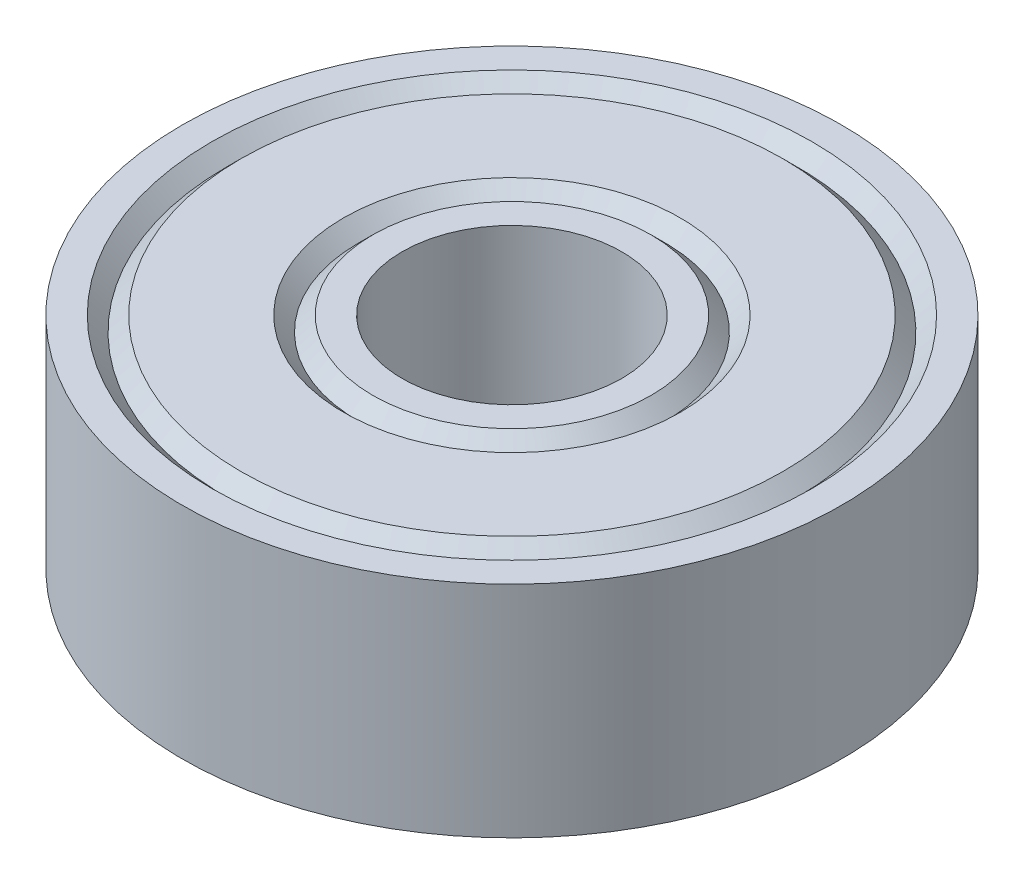
ISO-10303-21;
HEADER;
FILE_DESCRIPTION(('STEP AP214'),'2;1');
FILE_NAME('part.step','',(''),(''),'','','');
FILE_SCHEMA(('AUTOMOTIVE_DESIGN { 1 0 10303 214 1 1 1 1 }'));
ENDSEC;
DATA;
#1=APPLICATION_CONTEXT('core data for automotive mechanical design processes');
#2=APPLICATION_PROTOCOL_DEFINITION('international standard','automotive_design',2000,#1);
#3=PRODUCT_CONTEXT('',#1,'mechanical');
#4=PRODUCT('Part','Part','',(#3));
#5=PRODUCT_RELATED_PRODUCT_CATEGORY('part','',(#4));
#6=PRODUCT_DEFINITION_FORMATION('','',#4);
#7=PRODUCT_DEFINITION_CONTEXT('part definition',#1,'design');
#8=PRODUCT_DEFINITION('design','',#6,#7);
#9=PRODUCT_DEFINITION_SHAPE('','',#8);
#10=(LENGTH_UNIT() NAMED_UNIT(*) SI_UNIT(.MILLI.,.METRE.));
#11=(NAMED_UNIT(*) PLANE_ANGLE_UNIT() SI_UNIT($,.RADIAN.));
#12=(NAMED_UNIT(*) SI_UNIT($,.STERADIAN.) SOLID_ANGLE_UNIT());
#13=UNCERTAINTY_MEASURE_WITH_UNIT(LENGTH_MEASURE(1.E-05),#10,'distance_accuracy_value','');
#14=(GEOMETRIC_REPRESENTATION_CONTEXT(3) GLOBAL_UNCERTAINTY_ASSIGNED_CONTEXT((#13)) GLOBAL_UNIT_ASSIGNED_CONTEXT((#10,
#11,#12)) REPRESENTATION_CONTEXT('',''));
#15=CARTESIAN_POINT('',(0.,0.,0.));
#16=DIRECTION('',(0.,0.,1.));
#17=DIRECTION('',(1.,0.,0.));
#18=AXIS2_PLACEMENT_3D('',#15,#16,#17);
#19=CARTESIAN_POINT('',(0.,4.,0.));
#20=DIRECTION('',(0.,1.,0.));
#21=DIRECTION('',(-1.,0.,0.));
#22=AXIS2_PLACEMENT_3D('',#19,#20,#21);
#23=CYLINDRICAL_SURFACE('',#22,4.);
#24=CARTESIAN_POINT('',(0.,4.00000000000001,0.));
#25=DIRECTION('',(0.,1.,0.));
#26=DIRECTION('',(-1.,0.,0.));
#27=AXIS2_PLACEMENT_3D('',#24,#25,#26);
#28=CIRCLE('',#27,4.);
#29=CARTESIAN_POINT('',(-4.,4.00000000000001,0.));
#30=VERTEX_POINT('',#29);
#31=EDGE_CURVE('E83',#30,#30,#28,.T.);
#32=ORIENTED_EDGE('',*,*,#31,.T.);
#33=EDGE_LOOP('',(#32));
#34=FACE_BOUND('',#33,.T.);
#35=CARTESIAN_POINT('',(0.,-4.00000000000001,0.));
#36=DIRECTION('',(0.,1.,0.));
#37=DIRECTION('',(-1.,0.,0.));
#38=AXIS2_PLACEMENT_3D('',#35,#36,#37);
#39=CIRCLE('',#38,4.);
#40=CARTESIAN_POINT('',(-4.,-4.00000000000001,0.));
#41=VERTEX_POINT('',#40);
#42=EDGE_CURVE('E10',#41,#41,#39,.T.);
#43=ORIENTED_EDGE('',*,*,#42,.F.);
#44=EDGE_LOOP('',(#43));
#45=FACE_BOUND('',#44,.T.);
#46=ADVANCED_FACE('F31',(#34,#45),#23,.F.);
#47=CARTESIAN_POINT('',(-4.,-4.,0.));
#48=DIRECTION('',(0.,-1.,0.));
#49=DIRECTION('',(1.,0.,0.));
#50=AXIS2_PLACEMENT_3D('',#47,#48,#49);
#51=PLANE('',#50);
#52=ORIENTED_EDGE('',*,*,#42,.T.);
#53=EDGE_LOOP('',(#52));
#54=FACE_BOUND('',#53,.T.);
#55=CARTESIAN_POINT('',(0.,-4.,0.));
#56=DIRECTION('',(0.,1.,0.));
#57=DIRECTION('',(-1.,0.,0.));
#58=AXIS2_PLACEMENT_3D('',#55,#56,#57);
#59=CIRCLE('',#58,5.06666666666667);
#60=CARTESIAN_POINT('',(-5.06666666666667,-4.,0.));
#61=VERTEX_POINT('',#60);
#62=EDGE_CURVE('E37',#61,#61,#59,.T.);
#63=ORIENTED_EDGE('',*,*,#62,.F.);
#64=EDGE_LOOP('',(#63));
#65=FACE_BOUND('',#64,.T.);
#66=ADVANCED_FACE('F101',(#54,#65),#51,.T.);
#67=CARTESIAN_POINT('',(0.,-3.46666666666667,0.));
#68=DIRECTION('',(0.,1.,0.));
#69=DIRECTION('',(-1.,0.,0.));
#70=AXIS2_PLACEMENT_3D('',#67,#68,#69);
#71=CONICAL_SURFACE('',#70,5.6,0.785398163397448);
#72=ORIENTED_EDGE('',*,*,#62,.T.);
#73=EDGE_LOOP('',(#72));
#74=FACE_BOUND('',#73,.T.);
#75=CARTESIAN_POINT('',(0.,-3.46666666666667,0.));
#76=DIRECTION('',(0.,1.,0.));
#77=DIRECTION('',(-1.,0.,0.));
#78=AXIS2_PLACEMENT_3D('',#75,#76,#77);
#79=CIRCLE('',#78,5.6);
#80=CARTESIAN_POINT('',(-5.6,-3.46666666666667,0.));
#81=VERTEX_POINT('',#80);
#82=EDGE_CURVE('E41',#81,#81,#79,.T.);
#83=ORIENTED_EDGE('',*,*,#82,.F.);
#84=EDGE_LOOP('',(#83));
#85=FACE_BOUND('',#84,.T.);
#86=ADVANCED_FACE('F105',(#74,#85),#71,.T.);
#87=CARTESIAN_POINT('',(0.,-4.,0.));
#88=DIRECTION('',(0.,-1.,0.));
#89=DIRECTION('',(1.,0.,0.));
#90=AXIS2_PLACEMENT_3D('',#87,#88,#89);
#91=CONICAL_SURFACE('',#90,6.13333333333333,0.785398163397448);
#92=ORIENTED_EDGE('',*,*,#82,.T.);
#93=EDGE_LOOP('',(#92));
#94=FACE_BOUND('',#93,.T.);
#95=CARTESIAN_POINT('',(0.,-4.,0.));
#96=DIRECTION('',(0.,1.,0.));
#97=DIRECTION('',(-1.,0.,0.));
#98=AXIS2_PLACEMENT_3D('',#95,#96,#97);
#99=CIRCLE('',#98,6.13333333333333);
#100=CARTESIAN_POINT('',(-6.13333333333333,-4.,0.));
#101=VERTEX_POINT('',#100);
#102=EDGE_CURVE('E45',#101,#101,#99,.T.);
#103=ORIENTED_EDGE('',*,*,#102,.F.);
#104=EDGE_LOOP('',(#103));
#105=FACE_BOUND('',#104,.T.);
#106=ADVANCED_FACE('F109',(#94,#105),#91,.F.);
#107=CARTESIAN_POINT('',(-6.13333333333333,-4.,0.));
#108=DIRECTION('',(0.,-1.,0.));
#109=DIRECTION('',(1.,0.,0.));
#110=AXIS2_PLACEMENT_3D('',#107,#108,#109);
#111=PLANE('',#110);
#112=ORIENTED_EDGE('',*,*,#102,.T.);
#113=EDGE_LOOP('',(#112));
#114=FACE_BOUND('',#113,.T.);
#115=CARTESIAN_POINT('',(0.,-4.,0.));
#116=DIRECTION('',(0.,1.,0.));
#117=DIRECTION('',(-1.,0.,0.));
#118=AXIS2_PLACEMENT_3D('',#115,#116,#117);
#119=CIRCLE('',#118,9.86666666666667);
#120=CARTESIAN_POINT('',(-9.86666666666667,-4.,0.));
#121=VERTEX_POINT('',#120);
#122=EDGE_CURVE('E50',#121,#121,#119,.T.);
#123=ORIENTED_EDGE('',*,*,#122,.F.);
#124=EDGE_LOOP('',(#123));
#125=FACE_BOUND('',#124,.T.);
#126=ADVANCED_FACE('F115',(#114,#125),#111,.T.);
#127=CARTESIAN_POINT('',(0.,-3.46666666666667,0.));
#128=DIRECTION('',(0.,1.,0.));
#129=DIRECTION('',(-1.,0.,0.));
#130=AXIS2_PLACEMENT_3D('',#127,#128,#129);
#131=CONICAL_SURFACE('',#130,10.4,0.78539816339745);
#132=ORIENTED_EDGE('',*,*,#122,.T.);
#133=EDGE_LOOP('',(#132));
#134=FACE_BOUND('',#133,.T.);
#135=CARTESIAN_POINT('',(0.,-3.46666666666667,0.));
#136=DIRECTION('',(0.,1.,0.));
#137=DIRECTION('',(-1.,0.,0.));
#138=AXIS2_PLACEMENT_3D('',#135,#136,#137);
#139=CIRCLE('',#138,10.4);
#140=CARTESIAN_POINT('',(-10.4,-3.46666666666667,0.));
#141=VERTEX_POINT('',#140);
#142=EDGE_CURVE('E53',#141,#141,#139,.T.);
#143=ORIENTED_EDGE('',*,*,#142,.F.);
#144=EDGE_LOOP('',(#143));
#145=FACE_BOUND('',#144,.T.);
#146=ADVANCED_FACE('F119',(#134,#145),#131,.T.);
#147=CARTESIAN_POINT('',(0.,-4.,0.));
#148=DIRECTION('',(0.,-1.,0.));
#149=DIRECTION('',(1.,0.,0.));
#150=AXIS2_PLACEMENT_3D('',#147,#148,#149);
#151=CONICAL_SURFACE('',#150,10.9333333333333,0.785398163397447);
#152=ORIENTED_EDGE('',*,*,#142,.T.);
#153=EDGE_LOOP('',(#152));
#154=FACE_BOUND('',#153,.T.);
#155=CARTESIAN_POINT('',(0.,-4.,0.));
#156=DIRECTION('',(0.,1.,0.));
#157=DIRECTION('',(-1.,0.,0.));
#158=AXIS2_PLACEMENT_3D('',#155,#156,#157);
#159=CIRCLE('',#158,10.9333333333333);
#160=CARTESIAN_POINT('',(-10.9333333333333,-4.,0.));
#161=VERTEX_POINT('',#160);
#162=EDGE_CURVE('E56',#161,#161,#159,.T.);
#163=ORIENTED_EDGE('',*,*,#162,.F.);
#164=EDGE_LOOP('',(#163));
#165=FACE_BOUND('',#164,.T.);
#166=ADVANCED_FACE('F123',(#154,#165),#151,.F.);
#167=CARTESIAN_POINT('',(-10.9333333333333,-4.,0.));
#168=DIRECTION('',(0.,-1.,0.));
#169=DIRECTION('',(1.,0.,0.));
#170=AXIS2_PLACEMENT_3D('',#167,#168,#169);
#171=PLANE('',#170);
#172=ORIENTED_EDGE('',*,*,#162,.T.);
#173=EDGE_LOOP('',(#172));
#174=FACE_BOUND('',#173,.T.);
#175=CARTESIAN_POINT('',(0.,-4.,0.));
#176=DIRECTION('',(0.,1.,0.));
#177=DIRECTION('',(-1.,0.,0.));
#178=AXIS2_PLACEMENT_3D('',#175,#176,#177);
#179=CIRCLE('',#178,12.);
#180=CARTESIAN_POINT('',(-12.,-4.,0.));
#181=VERTEX_POINT('',#180);
#182=EDGE_CURVE('E59',#181,#181,#179,.T.);
#183=ORIENTED_EDGE('',*,*,#182,.F.);
#184=EDGE_LOOP('',(#183));
#185=FACE_BOUND('',#184,.T.);
#186=ADVANCED_FACE('F127',(#174,#185),#171,.T.);
#187=CARTESIAN_POINT('',(0.,4.,0.));
#188=DIRECTION('',(0.,1.,0.));
#189=DIRECTION('',(-1.,0.,0.));
#190=AXIS2_PLACEMENT_3D('',#187,#188,#189);
#191=CYLINDRICAL_SURFACE('',#190,12.);
#192=ORIENTED_EDGE('',*,*,#182,.T.);
#193=EDGE_LOOP('',(#192));
#194=FACE_BOUND('',#193,.T.);
#195=CARTESIAN_POINT('',(0.,4.,0.));
#196=DIRECTION('',(0.,1.,0.));
#197=DIRECTION('',(-1.,0.,0.));
#198=AXIS2_PLACEMENT_3D('',#195,#196,#197);
#199=CIRCLE('',#198,12.);
#200=CARTESIAN_POINT('',(-12.,4.,0.));
#201=VERTEX_POINT('',#200);
#202=EDGE_CURVE('E62',#201,#201,#199,.T.);
#203=ORIENTED_EDGE('',*,*,#202,.F.);
#204=EDGE_LOOP('',(#203));
#205=FACE_BOUND('',#204,.T.);
#206=ADVANCED_FACE('F131',(#194,#205),#191,.T.);
#207=CARTESIAN_POINT('',(-10.9333333333333,4.,0.));
#208=DIRECTION('',(0.,1.,0.));
#209=DIRECTION('',(-1.,0.,0.));
#210=AXIS2_PLACEMENT_3D('',#207,#208,#209);
#211=PLANE('',#210);
#212=ORIENTED_EDGE('',*,*,#202,.T.);
#213=EDGE_LOOP('',(#212));
#214=FACE_BOUND('',#213,.T.);
#215=CARTESIAN_POINT('',(0.,4.,0.));
#216=DIRECTION('',(0.,1.,0.));
#217=DIRECTION('',(-1.,0.,0.));
#218=AXIS2_PLACEMENT_3D('',#215,#216,#217);
#219=CIRCLE('',#218,10.9333333333333);
#220=CARTESIAN_POINT('',(-10.9333333333333,4.,0.));
#221=VERTEX_POINT('',#220);
#222=EDGE_CURVE('E65',#221,#221,#219,.T.);
#223=ORIENTED_EDGE('',*,*,#222,.F.);
#224=EDGE_LOOP('',(#223));
#225=FACE_BOUND('',#224,.T.);
#226=ADVANCED_FACE('F135',(#214,#225),#211,.T.);
#227=CARTESIAN_POINT('',(0.,3.46666666666666,0.));
#228=DIRECTION('',(0.,1.,0.));
#229=DIRECTION('',(-1.,0.,0.));
#230=AXIS2_PLACEMENT_3D('',#227,#228,#229);
#231=CONICAL_SURFACE('',#230,10.4,0.785398163397448);
#232=ORIENTED_EDGE('',*,*,#222,.T.);
#233=EDGE_LOOP('',(#232));
#234=FACE_BOUND('',#233,.T.);
#235=CARTESIAN_POINT('',(0.,3.46666666666666,0.));
#236=DIRECTION('',(0.,1.,0.));
#237=DIRECTION('',(-1.,0.,0.));
#238=AXIS2_PLACEMENT_3D('',#235,#236,#237);
#239=CIRCLE('',#238,10.4);
#240=CARTESIAN_POINT('',(-10.4,3.46666666666667,0.));
#241=VERTEX_POINT('',#240);
#242=EDGE_CURVE('E68',#241,#241,#239,.T.);
#243=ORIENTED_EDGE('',*,*,#242,.F.);
#244=EDGE_LOOP('',(#243));
#245=FACE_BOUND('',#244,.T.);
#246=ADVANCED_FACE('F139',(#234,#245),#231,.F.);
#247=CARTESIAN_POINT('',(0.,4.,0.));
#248=DIRECTION('',(0.,-1.,0.));
#249=DIRECTION('',(1.,0.,0.));
#250=AXIS2_PLACEMENT_3D('',#247,#248,#249);
#251=CONICAL_SURFACE('',#250,9.86666666666667,0.78539816339745);
#252=ORIENTED_EDGE('',*,*,#242,.T.);
#253=EDGE_LOOP('',(#252));
#254=FACE_BOUND('',#253,.T.);
#255=CARTESIAN_POINT('',(0.,4.,0.));
#256=DIRECTION('',(0.,1.,0.));
#257=DIRECTION('',(-1.,0.,0.));
#258=AXIS2_PLACEMENT_3D('',#255,#256,#257);
#259=CIRCLE('',#258,9.86666666666667);
#260=CARTESIAN_POINT('',(-9.86666666666667,4.,0.));
#261=VERTEX_POINT('',#260);
#262=EDGE_CURVE('E71',#261,#261,#259,.T.);
#263=ORIENTED_EDGE('',*,*,#262,.F.);
#264=EDGE_LOOP('',(#263));
#265=FACE_BOUND('',#264,.T.);
#266=ADVANCED_FACE('F143',(#254,#265),#251,.T.);
#267=CARTESIAN_POINT('',(-6.13333333333333,4.,0.));
#268=DIRECTION('',(0.,1.,0.));
#269=DIRECTION('',(-1.,0.,0.));
#270=AXIS2_PLACEMENT_3D('',#267,#268,#269);
#271=PLANE('',#270);
#272=ORIENTED_EDGE('',*,*,#262,.T.);
#273=EDGE_LOOP('',(#272));
#274=FACE_BOUND('',#273,.T.);
#275=CARTESIAN_POINT('',(0.,4.,0.));
#276=DIRECTION('',(0.,1.,0.));
#277=DIRECTION('',(-1.,0.,0.));
#278=AXIS2_PLACEMENT_3D('',#275,#276,#277);
#279=CIRCLE('',#278,6.13333333333334);
#280=CARTESIAN_POINT('',(-6.13333333333333,4.,0.));
#281=VERTEX_POINT('',#280);
#282=EDGE_CURVE('E74',#281,#281,#279,.T.);
#283=ORIENTED_EDGE('',*,*,#282,.F.);
#284=EDGE_LOOP('',(#283));
#285=FACE_BOUND('',#284,.T.);
#286=ADVANCED_FACE('F147',(#274,#285),#271,.T.);
#287=CARTESIAN_POINT('',(0.,3.46666666666667,0.));
#288=DIRECTION('',(0.,1.,0.));
#289=DIRECTION('',(-1.,0.,0.));
#290=AXIS2_PLACEMENT_3D('',#287,#288,#289);
#291=CONICAL_SURFACE('',#290,5.6,0.785398163397448);
#292=ORIENTED_EDGE('',*,*,#282,.T.);
#293=EDGE_LOOP('',(#292));
#294=FACE_BOUND('',#293,.T.);
#295=CARTESIAN_POINT('',(0.,3.46666666666667,0.));
#296=DIRECTION('',(0.,1.,0.));
#297=DIRECTION('',(-1.,0.,0.));
#298=AXIS2_PLACEMENT_3D('',#295,#296,#297);
#299=CIRCLE('',#298,5.6);
#300=CARTESIAN_POINT('',(-5.6,3.46666666666667,0.));
#301=VERTEX_POINT('',#300);
#302=EDGE_CURVE('E77',#301,#301,#299,.T.);
#303=ORIENTED_EDGE('',*,*,#302,.F.);
#304=EDGE_LOOP('',(#303));
#305=FACE_BOUND('',#304,.T.);
#306=ADVANCED_FACE('F97',(#294,#305),#291,.F.);
#307=CARTESIAN_POINT('',(0.,4.,0.));
#308=DIRECTION('',(0.,-1.,0.));
#309=DIRECTION('',(1.,0.,0.));
#310=AXIS2_PLACEMENT_3D('',#307,#308,#309);
#311=CONICAL_SURFACE('',#310,5.06666666666667,0.785398163397448);
#312=ORIENTED_EDGE('',*,*,#302,.T.);
#313=EDGE_LOOP('',(#312));
#314=FACE_BOUND('',#313,.T.);
#315=CARTESIAN_POINT('',(0.,4.,0.));
#316=DIRECTION('',(0.,1.,0.));
#317=DIRECTION('',(-1.,0.,0.));
#318=AXIS2_PLACEMENT_3D('',#315,#316,#317);
#319=CIRCLE('',#318,5.06666666666667);
#320=CARTESIAN_POINT('',(-5.06666666666667,4.,0.));
#321=VERTEX_POINT('',#320);
#322=EDGE_CURVE('E80',#321,#321,#319,.T.);
#323=ORIENTED_EDGE('',*,*,#322,.F.);
#324=EDGE_LOOP('',(#323));
#325=FACE_BOUND('',#324,.T.);
#326=ADVANCED_FACE('F91',(#314,#325),#311,.T.);
#327=CARTESIAN_POINT('',(-4.,4.,0.));
#328=DIRECTION('',(0.,1.,0.));
#329=DIRECTION('',(-1.,0.,0.));
#330=AXIS2_PLACEMENT_3D('',#327,#328,#329);
#331=PLANE('',#330);
#332=ORIENTED_EDGE('',*,*,#322,.T.);
#333=EDGE_LOOP('',(#332));
#334=FACE_BOUND('',#333,.T.);
#335=ORIENTED_EDGE('',*,*,#31,.F.);
#336=EDGE_LOOP('',(#335));
#337=FACE_BOUND('',#336,.T.);
#338=ADVANCED_FACE('F89',(#334,#337),#331,.T.);
#339=CLOSED_SHELL('',(#46,#66,#86,#106,#126,#146,#166,#186,#206,#226,#246,#266,#286,#306,#326,#338));
#340=MANIFOLD_SOLID_BREP('B2',#339);
#341=ADVANCED_BREP_SHAPE_REPRESENTATION('',(#18,#340),#14);
#342=SHAPE_DEFINITION_REPRESENTATION(#9,#341);
ENDSEC;
END-ISO-10303-21;
